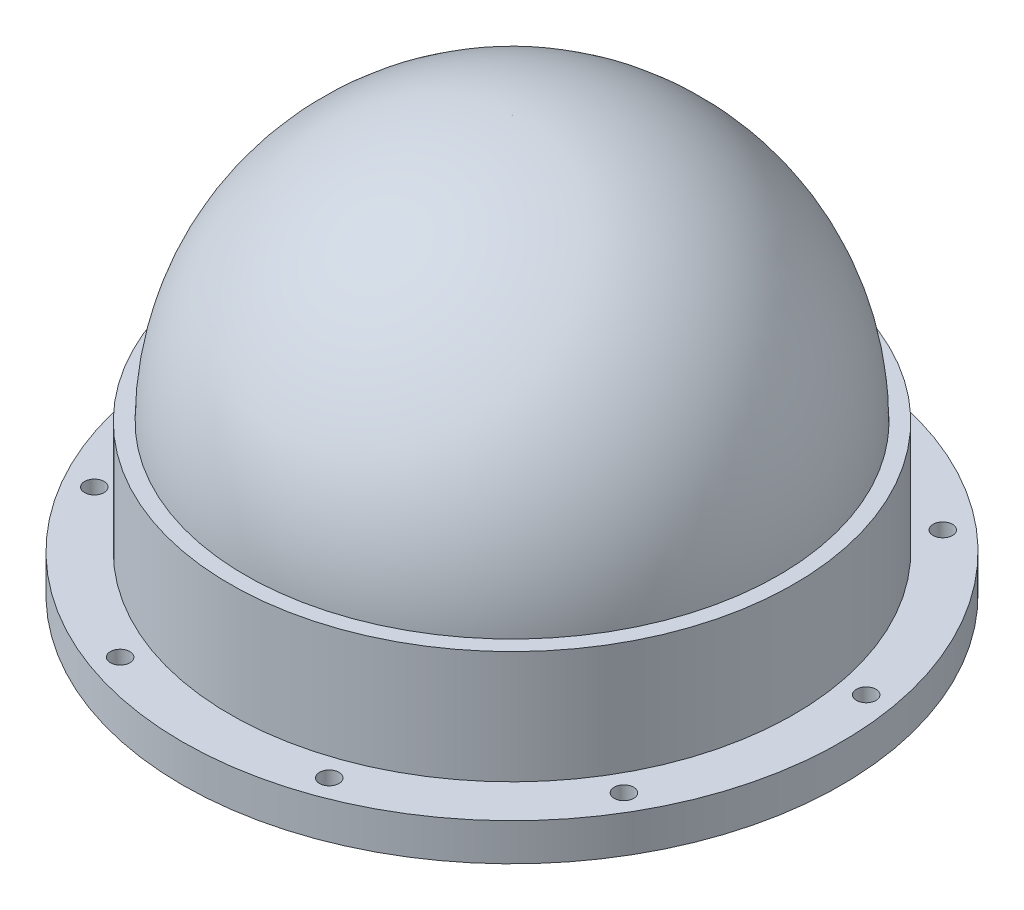
ISO-10303-21;
HEADER;
FILE_DESCRIPTION(('STEP AP214'),'2;1');
FILE_NAME('part.step','',(''),(''),'','','');
FILE_SCHEMA(('AUTOMOTIVE_DESIGN { 1 0 10303 214 1 1 1 1 }'));
ENDSEC;
DATA;
#1=APPLICATION_CONTEXT('core data for automotive mechanical design processes');
#2=APPLICATION_PROTOCOL_DEFINITION('international standard','automotive_design',2000,#1);
#3=PRODUCT_CONTEXT('',#1,'mechanical');
#4=PRODUCT('Part','Part','',(#3));
#5=PRODUCT_RELATED_PRODUCT_CATEGORY('part','',(#4));
#6=PRODUCT_DEFINITION_FORMATION('','',#4);
#7=PRODUCT_DEFINITION_CONTEXT('part definition',#1,'design');
#8=PRODUCT_DEFINITION('design','',#6,#7);
#9=PRODUCT_DEFINITION_SHAPE('','',#8);
#10=(LENGTH_UNIT() NAMED_UNIT(*) SI_UNIT(.MILLI.,.METRE.));
#11=(NAMED_UNIT(*) PLANE_ANGLE_UNIT() SI_UNIT($,.RADIAN.));
#12=(NAMED_UNIT(*) SI_UNIT($,.STERADIAN.) SOLID_ANGLE_UNIT());
#13=UNCERTAINTY_MEASURE_WITH_UNIT(LENGTH_MEASURE(1.E-05),#10,'distance_accuracy_value','');
#14=(GEOMETRIC_REPRESENTATION_CONTEXT(3) GLOBAL_UNCERTAINTY_ASSIGNED_CONTEXT((#13)) GLOBAL_UNIT_ASSIGNED_CONTEXT((#10,
#11,#12)) REPRESENTATION_CONTEXT('',''));
#15=CARTESIAN_POINT('',(0.,0.,0.));
#16=DIRECTION('',(0.,0.,1.));
#17=DIRECTION('',(1.,0.,0.));
#18=AXIS2_PLACEMENT_3D('',#15,#16,#17);
#19=CARTESIAN_POINT('',(0.,51.562,0.));
#20=DIRECTION('',(0.,1.,0.));
#21=DIRECTION('',(1.,0.,0.));
#22=AXIS2_PLACEMENT_3D('',#19,#20,#21);
#23=SPHERICAL_SURFACE('',#22,92.456);
#24=CARTESIAN_POINT('',(0.1,51.562,0.));
#25=DIRECTION('',(1.,0.,0.));
#26=DIRECTION('',(0.,0.,-1.));
#27=AXIS2_PLACEMENT_3D('',#24,#25,#26);
#28=CIRCLE('',#27,92.4559459202057);
#29=CARTESIAN_POINT('',(0.1,144.01789184038,-0.1));
#30=VERTEX_POINT('',#29);
#31=CARTESIAN_POINT('',(0.1,144.017945920206,-7.97691202139997E-13));
#32=VERTEX_POINT('',#31);
#33=EDGE_CURVE('E119',#30,#32,#28,.T.);
#34=ORIENTED_EDGE('',*,*,#33,.T.);
#35=CARTESIAN_POINT('',(0.1,144.01789184038,0.0999999999999999));
#36=VERTEX_POINT('',#35);
#37=EDGE_CURVE('E12',#32,#36,#28,.T.);
#38=ORIENTED_EDGE('',*,*,#37,.T.);
#39=CARTESIAN_POINT('',(0.,51.562,0.0999999999999986));
#40=DIRECTION('',(0.,0.,1.));
#41=DIRECTION('',(0.,-1.,0.));
#42=AXIS2_PLACEMENT_3D('',#39,#40,#41);
#43=CIRCLE('',#42,92.4559459202057);
#44=CARTESIAN_POINT('',(0.,144.017945920206,0.0999999999999999));
#45=VERTEX_POINT('',#44);
#46=EDGE_CURVE('E60',#36,#45,#43,.T.);
#47=ORIENTED_EDGE('',*,*,#46,.T.);
#48=CARTESIAN_POINT('',(0.,144.017945920206,0.));
#49=DIRECTION('',(0.,-1.,0.));
#50=DIRECTION('',(0.,0.,-1.));
#51=AXIS2_PLACEMENT_3D('',#48,#49,#50);
#52=CIRCLE('',#51,0.0999999999476613);
#53=EDGE_CURVE('E211',#32,#45,#52,.T.);
#54=ORIENTED_EDGE('',*,*,#53,.F.);
#55=CARTESIAN_POINT('',(0.100000000000009,144.017945920206,0.));
#56=CARTESIAN_POINT('',(0.0958333349581409,144.017950426855,0.));
#57=CARTESIAN_POINT('',(0.0916666696116241,144.017954651838,0.));
#58=CARTESIAN_POINT('',(0.0833333383854562,144.017962538475,0.));
#59=CARTESIAN_POINT('',(0.0791666725058049,144.017966200127,0.));
#60=CARTESIAN_POINT('',(0.07083334028953,144.017972960101,0.));
#61=CARTESIAN_POINT('',(0.0666666739529063,144.017976058423,0.));
#62=CARTESIAN_POINT('',(0.0583333408988416,144.017981691735,0.));
#63=CARTESIAN_POINT('',(0.0541666741814006,144.017984226726,0.));
#64=CARTESIAN_POINT('',(0.0458333404418841,144.017988733375,0.));
#65=CARTESIAN_POINT('',(0.0416666734198084,144.017990705035,0.));
#66=CARTESIAN_POINT('',(0.0333333391471573,144.017994085022,0.));
#67=CARTESIAN_POINT('',(0.0291666718965817,144.01799549335,0.));
#68=CARTESIAN_POINT('',(0.0208333372431133,144.017997746675,0.));
#69=CARTESIAN_POINT('',(0.0166666698402204,144.017998591672,0.));
#70=CARTESIAN_POINT('',(0.00833333495827252,144.017999718334,0.));
#71=CARTESIAN_POINT('',(0.00416666747921755,144.018,0.));
#72=CARTESIAN_POINT('',(1.62573284894787E-13,144.018,0.));
#73=B_SPLINE_CURVE_WITH_KNOTS('',3,(#55,#56,#57,#58,#59,#60,#61,#62,#63,#64,#65,#66,#67,#68,#69,
#70,#71,#72),.UNSPECIFIED.,.F.,.F.,(4,2,2,2,2,2,2,2,4),(0.,0.0125000024276447,
0.0250000048552893,0.037500007282934,0.0500000097105992,0.0625000121382233,0.0750000145658885,
0.0875000169935332,0.100000019421178),.UNSPECIFIED.);
#74=CARTESIAN_POINT('',(0.,144.018,0.));
#75=VERTEX_POINT('',#74);
#76=EDGE_CURVE('E111',#32,#75,#73,.T.);
#77=ORIENTED_EDGE('',*,*,#76,.T.);
#78=CARTESIAN_POINT('',(0.,51.562,0.));
#79=DIRECTION('',(1.,0.,0.));
#80=DIRECTION('',(0.,0.,-1.));
#81=AXIS2_PLACEMENT_3D('',#78,#79,#80);
#82=CIRCLE('',#81,92.456);
#83=CARTESIAN_POINT('',(0.,144.017945920206,-0.1));
#84=VERTEX_POINT('',#83);
#85=EDGE_CURVE('E193',#84,#75,#82,.T.);
#86=ORIENTED_EDGE('',*,*,#85,.F.);
#87=CARTESIAN_POINT('',(0.,51.562,-0.100000000000015));
#88=DIRECTION('',(0.,0.,-1.));
#89=DIRECTION('',(0.,1.,0.));
#90=AXIS2_PLACEMENT_3D('',#87,#88,#89);
#91=CIRCLE('',#90,92.4559459202057);
#92=EDGE_CURVE('E199',#84,#30,#91,.T.);
#93=ORIENTED_EDGE('',*,*,#92,.T.);
#94=EDGE_LOOP('',(#34,#38,#47,#54,#77,#86,#93));
#95=FACE_BOUND('',#94,.T.);
#96=CARTESIAN_POINT('',(-1.54672976553365E-13,51.5620000000002,0.));
#97=DIRECTION('',(0.,1.,0.));
#98=DIRECTION('',(-1.,0.,0.));
#99=AXIS2_PLACEMENT_3D('',#96,#97,#98);
#100=CIRCLE('',#99,92.4560000000001);
#101=CARTESIAN_POINT('',(-92.4560000000003,51.5620000000003,0.));
#102=VERTEX_POINT('',#101);
#103=EDGE_CURVE('E110',#102,#102,#100,.T.);
#104=ORIENTED_EDGE('',*,*,#103,.T.);
#105=EDGE_LOOP('',(#104));
#106=FACE_BOUND('',#105,.T.);
#107=ADVANCED_FACE('F49',(#95,#106),#23,.T.);
#108=CARTESIAN_POINT('',(0.,56.388,0.));
#109=DIRECTION('',(0.,1.,0.));
#110=DIRECTION('',(-1.,0.,0.));
#111=AXIS2_PLACEMENT_3D('',#108,#109,#110);
#112=SPHERICAL_SURFACE('',#111,80.01);
#113=CARTESIAN_POINT('',(-1.46152911392784E-13,56.3880000000001,0.));
#114=DIRECTION('',(0.,1.,0.));
#115=DIRECTION('',(-1.,0.,0.));
#116=AXIS2_PLACEMENT_3D('',#113,#114,#115);
#117=CIRCLE('',#116,80.0100000000001);
#118=CARTESIAN_POINT('',(-80.0100000000003,56.3880000000003,0.));
#119=VERTEX_POINT('',#118);
#120=EDGE_CURVE('E190',#119,#119,#117,.T.);
#121=ORIENTED_EDGE('',*,*,#120,.F.);
#122=EDGE_LOOP('',(#121));
#123=FACE_BOUND('',#122,.T.);
#124=ADVANCED_FACE('F179',(#123),#112,.F.);
#125=CARTESIAN_POINT('',(0.,144.018,0.));
#126=DIRECTION('',(0.,1.,0.));
#127=DIRECTION('',(-1.,0.,0.));
#128=AXIS2_PLACEMENT_3D('',#125,#126,#127);
#129=CYLINDRICAL_SURFACE('',#128,80.0100000000002);
#130=CARTESIAN_POINT('',(-1.80681596517245E-13,36.8300000000001,0.));
#131=DIRECTION('',(0.,1.,0.));
#132=DIRECTION('',(-1.,0.,0.));
#133=AXIS2_PLACEMENT_3D('',#130,#131,#132);
#134=CIRCLE('',#133,80.0100000000002);
#135=CARTESIAN_POINT('',(-80.0100000000004,36.8300000000003,0.));
#136=VERTEX_POINT('',#135);
#137=EDGE_CURVE('E194',#136,#136,#134,.T.);
#138=ORIENTED_EDGE('',*,*,#137,.F.);
#139=EDGE_LOOP('',(#138));
#140=FACE_BOUND('',#139,.T.);
#141=ORIENTED_EDGE('',*,*,#120,.T.);
#142=EDGE_LOOP('',(#141));
#143=FACE_BOUND('',#142,.T.);
#144=ADVANCED_FACE('F176',(#140,#143),#129,.F.);
#145=CARTESIAN_POINT('',(92.456,36.83,0.));
#146=DIRECTION('',(0.,1.,0.));
#147=DIRECTION('',(-1.,0.,0.));
#148=AXIS2_PLACEMENT_3D('',#145,#146,#147);
#149=PLANE('',#148);
#150=CARTESIAN_POINT('',(-1.80681596517245E-13,36.8300000000002,0.));
#151=DIRECTION('',(0.,1.,0.));
#152=DIRECTION('',(-1.,0.,0.));
#153=AXIS2_PLACEMENT_3D('',#150,#151,#152);
#154=CIRCLE('',#153,92.4560000000002);
#155=CARTESIAN_POINT('',(-92.4560000000004,36.8300000000003,0.));
#156=VERTEX_POINT('',#155);
#157=EDGE_CURVE('E202',#156,#156,#154,.T.);
#158=ORIENTED_EDGE('',*,*,#157,.F.);
#159=EDGE_LOOP('',(#158));
#160=FACE_BOUND('',#159,.T.);
#161=ORIENTED_EDGE('',*,*,#137,.T.);
#162=EDGE_LOOP('',(#161));
#163=FACE_BOUND('',#162,.T.);
#164=ADVANCED_FACE('F172',(#160,#163),#149,.F.);
#165=CARTESIAN_POINT('',(0.,144.018,0.));
#166=DIRECTION('',(0.,1.,0.));
#167=DIRECTION('',(-1.,0.,0.));
#168=AXIS2_PLACEMENT_3D('',#165,#166,#167);
#169=CYLINDRICAL_SURFACE('',#168,92.4560000000002);
#170=ORIENTED_EDGE('',*,*,#103,.F.);
#171=EDGE_LOOP('',(#170));
#172=FACE_BOUND('',#171,.T.);
#173=ORIENTED_EDGE('',*,*,#157,.T.);
#174=EDGE_LOOP('',(#173));
#175=FACE_BOUND('',#174,.T.);
#176=ADVANCED_FACE('F169',(#172,#175),#169,.T.);
#177=CARTESIAN_POINT('',(0.1,0.,0.));
#178=DIRECTION('',(1.,0.,0.));
#179=DIRECTION('',(0.,0.,-1.));
#180=AXIS2_PLACEMENT_3D('',#177,#178,#179);
#181=PLANE('',#180);
#182=ORIENTED_EDGE('',*,*,#33,.F.);
#183=DIRECTION('',(0.,-1.,0.));
#184=VECTOR('',#183,1.);
#185=CARTESIAN_POINT('',(0.1,0.,-0.100000000000023));
#186=LINE('',#185,#184);
#187=CARTESIAN_POINT('',(0.1,144.018,-0.1));
#188=VERTEX_POINT('',#187);
#189=EDGE_CURVE('E102',#188,#30,#186,.T.);
#190=ORIENTED_EDGE('',*,*,#189,.F.);
#191=DIRECTION('',(0.,0.,-1.));
#192=VECTOR('',#191,1.);
#193=CARTESIAN_POINT('',(0.1,144.018,0.));
#194=LINE('',#193,#192);
#195=EDGE_CURVE('E117',#32,#188,#194,.T.);
#196=ORIENTED_EDGE('',*,*,#195,.F.);
#197=EDGE_LOOP('',(#182,#190,#196));
#198=FACE_BOUND('',#197,.T.);
#199=ADVANCED_FACE('F116',(#198),#181,.T.);
#200=CARTESIAN_POINT('',(0.,0.,0.));
#201=DIRECTION('',(1.,0.,0.));
#202=DIRECTION('',(0.,0.,-1.));
#203=AXIS2_PLACEMENT_3D('',#200,#201,#202);
#204=PLANE('',#203);
#205=DIRECTION('',(0.,-1.,0.));
#206=VECTOR('',#205,1.);
#207=CARTESIAN_POINT('',(0.,0.,-0.100000000000023));
#208=LINE('',#207,#206);
#209=CARTESIAN_POINT('',(0.,144.018,-0.1));
#210=VERTEX_POINT('',#209);
#211=EDGE_CURVE('E104',#210,#84,#208,.T.);
#212=ORIENTED_EDGE('',*,*,#211,.T.);
#213=ORIENTED_EDGE('',*,*,#85,.T.);
#214=DIRECTION('',(0.,0.,-1.));
#215=VECTOR('',#214,1.);
#216=CARTESIAN_POINT('',(0.,144.018,0.));
#217=LINE('',#216,#215);
#218=EDGE_CURVE('E138',#75,#210,#217,.T.);
#219=ORIENTED_EDGE('',*,*,#218,.T.);
#220=EDGE_LOOP('',(#212,#213,#219));
#221=FACE_BOUND('',#220,.T.);
#222=ADVANCED_FACE('F165',(#221),#204,.F.);
#223=CARTESIAN_POINT('',(0.1,0.,-0.100000000000023));
#224=DIRECTION('',(0.,0.,-1.));
#225=DIRECTION('',(0.,1.,0.));
#226=AXIS2_PLACEMENT_3D('',#223,#224,#225);
#227=PLANE('',#226);
#228=ORIENTED_EDGE('',*,*,#92,.F.);
#229=ORIENTED_EDGE('',*,*,#211,.F.);
#230=DIRECTION('',(-1.,0.,0.));
#231=VECTOR('',#230,1.);
#232=CARTESIAN_POINT('',(0.1,144.018,-0.1));
#233=LINE('',#232,#231);
#234=EDGE_CURVE('E98',#188,#210,#233,.T.);
#235=ORIENTED_EDGE('',*,*,#234,.F.);
#236=ORIENTED_EDGE('',*,*,#189,.T.);
#237=EDGE_LOOP('',(#228,#229,#235,#236));
#238=FACE_BOUND('',#237,.T.);
#239=ADVANCED_FACE('F101',(#238),#227,.T.);
#240=CARTESIAN_POINT('',(0.1,144.018,0.));
#241=DIRECTION('',(0.,1.,0.));
#242=DIRECTION('',(0.,0.,1.));
#243=AXIS2_PLACEMENT_3D('',#240,#241,#242);
#244=PLANE('',#243);
#245=ORIENTED_EDGE('',*,*,#218,.F.);
#246=ORIENTED_EDGE('',*,*,#76,.F.);
#247=ORIENTED_EDGE('',*,*,#195,.T.);
#248=ORIENTED_EDGE('',*,*,#234,.T.);
#249=EDGE_LOOP('',(#245,#246,#247,#248));
#250=FACE_BOUND('',#249,.T.);
#251=ADVANCED_FACE('F123',(#250),#244,.T.);
#252=CARTESIAN_POINT('',(0.1,0.,0.0999999999999979));
#253=DIRECTION('',(0.,0.,1.));
#254=DIRECTION('',(0.,-1.,0.));
#255=AXIS2_PLACEMENT_3D('',#252,#253,#254);
#256=PLANE('',#255);
#257=ORIENTED_EDGE('',*,*,#46,.F.);
#258=DIRECTION('',(0.,1.,0.));
#259=VECTOR('',#258,1.);
#260=CARTESIAN_POINT('',(0.1,0.,0.0999999999999979));
#261=LINE('',#260,#259);
#262=CARTESIAN_POINT('',(0.1,144.017945920206,0.0999999999999999));
#263=VERTEX_POINT('',#262);
#264=EDGE_CURVE('E74',#36,#263,#261,.T.);
#265=ORIENTED_EDGE('',*,*,#264,.T.);
#266=DIRECTION('',(-1.,0.,0.));
#267=VECTOR('',#266,1.);
#268=CARTESIAN_POINT('',(0.1,144.017945920206,0.0999999999999999));
#269=LINE('',#268,#267);
#270=EDGE_CURVE('E128',#263,#45,#269,.T.);
#271=ORIENTED_EDGE('',*,*,#270,.T.);
#272=EDGE_LOOP('',(#257,#265,#271));
#273=FACE_BOUND('',#272,.T.);
#274=ADVANCED_FACE('F160',(#273),#256,.T.);
#275=CARTESIAN_POINT('',(0.1,144.017945920206,0.));
#276=DIRECTION('',(0.,-1.,0.));
#277=DIRECTION('',(0.,0.,-1.));
#278=AXIS2_PLACEMENT_3D('',#275,#276,#277);
#279=PLANE('',#278);
#280=DIRECTION('',(0.,0.,1.));
#281=VECTOR('',#280,1.);
#282=CARTESIAN_POINT('',(0.1,144.017945920206,0.));
#283=LINE('',#282,#281);
#284=EDGE_CURVE('E68',#32,#263,#283,.T.);
#285=ORIENTED_EDGE('',*,*,#284,.F.);
#286=ORIENTED_EDGE('',*,*,#53,.T.);
#287=ORIENTED_EDGE('',*,*,#270,.F.);
#288=EDGE_LOOP('',(#285,#286,#287));
#289=FACE_BOUND('',#288,.T.);
#290=ADVANCED_FACE('F161',(#289),#279,.F.);
#291=ORIENTED_EDGE('',*,*,#37,.F.);
#292=ORIENTED_EDGE('',*,*,#284,.T.);
#293=ORIENTED_EDGE('',*,*,#264,.F.);
#294=EDGE_LOOP('',(#291,#292,#293));
#295=FACE_BOUND('',#294,.T.);
#296=ADVANCED_FACE('F226',(#295),#181,.T.);
#297=CLOSED_SHELL('',(#107,#124,#144,#164,#176,#199,#222,#239,#251,#274,#290,#296));
#298=MANIFOLD_SOLID_BREP('B2',#297);
#299=CARTESIAN_POINT('',(79.248,0.,0.));
#300=DIRECTION('',(0.,-1.,0.));
#301=DIRECTION('',(0.,0.,-1.));
#302=AXIS2_PLACEMENT_3D('',#299,#300,#301);
#303=PLANE('',#302);
#304=CARTESIAN_POINT('',(-5.99954073654749E-12,0.,-106.045));
#305=DIRECTION('',(0.,-1.,0.));
#306=DIRECTION('',(0.,0.,-1.));
#307=AXIS2_PLACEMENT_3D('',#304,#305,#306);
#308=CIRCLE('',#307,3.3782);
#309=CARTESIAN_POINT('',(-5.99954073654749E-12,0.,-109.4232));
#310=VERTEX_POINT('',#309);
#311=EDGE_CURVE('E404',#310,#310,#308,.T.);
#312=ORIENTED_EDGE('',*,*,#311,.F.);
#313=EDGE_LOOP('',(#312));
#314=FACE_BOUND('',#313,.T.);
#315=CARTESIAN_POINT('',(68.1644120692045,0.,-81.2351829705559));
#316=DIRECTION('',(0.,-1.,0.));
#317=DIRECTION('',(0.,0.,-1.));
#318=AXIS2_PLACEMENT_3D('',#315,#316,#317);
#319=CIRCLE('',#318,3.3782);
#320=CARTESIAN_POINT('',(68.1644120692045,0.,-84.6133829705559));
#321=VERTEX_POINT('',#320);
#322=EDGE_CURVE('E398',#321,#321,#319,.T.);
#323=ORIENTED_EDGE('',*,*,#322,.F.);
#324=EDGE_LOOP('',(#323));
#325=FACE_BOUND('',#324,.T.);
#326=CARTESIAN_POINT('',(104.433938168179,0.,-18.4145210006955));
#327=DIRECTION('',(0.,-1.,0.));
#328=DIRECTION('',(0.,0.,-1.));
#329=AXIS2_PLACEMENT_3D('',#326,#327,#328);
#330=CIRCLE('',#329,3.3782);
#331=CARTESIAN_POINT('',(104.433938168179,0.,-21.7927210006955));
#332=VERTEX_POINT('',#331);
#333=EDGE_CURVE('E392',#332,#332,#330,.T.);
#334=ORIENTED_EDGE('',*,*,#333,.F.);
#335=EDGE_LOOP('',(#334));
#336=FACE_BOUND('',#335,.T.);
#337=CARTESIAN_POINT('',(91.8376639443238,0.,53.0224999999948));
#338=DIRECTION('',(0.,-1.,0.));
#339=DIRECTION('',(0.,0.,-1.));
#340=AXIS2_PLACEMENT_3D('',#337,#338,#339);
#341=CIRCLE('',#340,3.3782);
#342=CARTESIAN_POINT('',(91.8376639443238,0.,49.6442999999948));
#343=VERTEX_POINT('',#342);
#344=EDGE_CURVE('E386',#343,#343,#341,.T.);
#345=ORIENTED_EDGE('',*,*,#344,.F.);
#346=EDGE_LOOP('',(#345));
#347=FACE_BOUND('',#346,.T.);
#348=CARTESIAN_POINT('',(36.2695260989762,0.,99.6497039712396));
#349=DIRECTION('',(0.,-1.,0.));
#350=DIRECTION('',(0.,0.,-1.));
#351=AXIS2_PLACEMENT_3D('',#348,#349,#350);
#352=CIRCLE('',#351,3.3782);
#353=CARTESIAN_POINT('',(36.2695260989762,0.,96.2715039712396));
#354=VERTEX_POINT('',#353);
#355=EDGE_CURVE('E380',#354,#354,#352,.T.);
#356=ORIENTED_EDGE('',*,*,#355,.F.);
#357=EDGE_LOOP('',(#356));
#358=FACE_BOUND('',#357,.T.);
#359=CARTESIAN_POINT('',(-36.2695260989649,0.,99.6497039712437));
#360=DIRECTION('',(0.,-1.,0.));
#361=DIRECTION('',(0.,0.,-1.));
#362=AXIS2_PLACEMENT_3D('',#359,#360,#361);
#363=CIRCLE('',#362,3.3782);
#364=CARTESIAN_POINT('',(-36.2695260989649,0.,96.2715039712437));
#365=VERTEX_POINT('',#364);
#366=EDGE_CURVE('E374',#365,#365,#363,.T.);
#367=ORIENTED_EDGE('',*,*,#366,.F.);
#368=EDGE_LOOP('',(#367));
#369=FACE_BOUND('',#368,.T.);
#370=CARTESIAN_POINT('',(-91.8376639443178,0.,53.0225000000052));
#371=DIRECTION('',(0.,-1.,0.));
#372=DIRECTION('',(0.,0.,-1.));
#373=AXIS2_PLACEMENT_3D('',#370,#371,#372);
#374=CIRCLE('',#373,3.3782);
#375=CARTESIAN_POINT('',(-91.8376639443178,0.,49.6443000000052));
#376=VERTEX_POINT('',#375);
#377=EDGE_CURVE('E368',#376,#376,#374,.T.);
#378=ORIENTED_EDGE('',*,*,#377,.F.);
#379=EDGE_LOOP('',(#378));
#380=FACE_BOUND('',#379,.T.);
#381=CARTESIAN_POINT('',(-104.433938168181,0.,-18.4145210006837));
#382=DIRECTION('',(0.,-1.,0.));
#383=DIRECTION('',(0.,0.,-1.));
#384=AXIS2_PLACEMENT_3D('',#381,#382,#383);
#385=CIRCLE('',#384,3.3782);
#386=CARTESIAN_POINT('',(-104.433938168181,0.,-21.7927210006837));
#387=VERTEX_POINT('',#386);
#388=EDGE_CURVE('E362',#387,#387,#385,.T.);
#389=ORIENTED_EDGE('',*,*,#388,.F.);
#390=EDGE_LOOP('',(#389));
#391=FACE_BOUND('',#390,.T.);
#392=CARTESIAN_POINT('',(-68.1644120692137,0.,-81.2351829705482));
#393=DIRECTION('',(0.,-1.,0.));
#394=DIRECTION('',(0.,0.,-1.));
#395=AXIS2_PLACEMENT_3D('',#392,#393,#394);
#396=CIRCLE('',#395,3.3782);
#397=CARTESIAN_POINT('',(-68.1644120692137,0.,-84.6133829705482));
#398=VERTEX_POINT('',#397);
#399=EDGE_CURVE('E356',#398,#398,#396,.T.);
#400=ORIENTED_EDGE('',*,*,#399,.F.);
#401=EDGE_LOOP('',(#400));
#402=FACE_BOUND('',#401,.T.);
#403=CARTESIAN_POINT('',(0.,0.,0.));
#404=DIRECTION('',(0.,-1.,0.));
#405=DIRECTION('',(0.,0.,-1.));
#406=AXIS2_PLACEMENT_3D('',#403,#404,#405);
#407=CIRCLE('',#406,114.3);
#408=CARTESIAN_POINT('',(0.,0.,-114.3));
#409=VERTEX_POINT('',#408);
#410=EDGE_CURVE('E48',#409,#409,#407,.T.);
#411=ORIENTED_EDGE('',*,*,#410,.T.);
#412=EDGE_LOOP('',(#411));
#413=FACE_BOUND('',#412,.T.);
#414=CARTESIAN_POINT('',(0.,0.,0.));
#415=DIRECTION('',(0.,-1.,0.));
#416=DIRECTION('',(0.,0.,-1.));
#417=AXIS2_PLACEMENT_3D('',#414,#415,#416);
#418=CIRCLE('',#417,79.248);
#419=CARTESIAN_POINT('',(0.,0.,-79.248));
#420=VERTEX_POINT('',#419);
#421=EDGE_CURVE('E353',#420,#420,#418,.T.);
#422=ORIENTED_EDGE('',*,*,#421,.F.);
#423=EDGE_LOOP('',(#422));
#424=FACE_BOUND('',#423,.T.);
#425=ADVANCED_FACE('F325',(#314,#325,#336,#347,#358,#369,#380,#391,#402,#413,#424),#303,.T.);
#426=CARTESIAN_POINT('',(0.,0.,0.));
#427=DIRECTION('',(0.,-1.,0.));
#428=DIRECTION('',(0.,0.,-1.));
#429=AXIS2_PLACEMENT_3D('',#426,#427,#428);
#430=CYLINDRICAL_SURFACE('',#429,114.3);
#431=CARTESIAN_POINT('',(0.,12.954,0.));
#432=DIRECTION('',(0.,-1.,0.));
#433=DIRECTION('',(0.,0.,-1.));
#434=AXIS2_PLACEMENT_3D('',#431,#432,#433);
#435=CIRCLE('',#434,114.3);
#436=CARTESIAN_POINT('',(0.,12.954,-114.3));
#437=VERTEX_POINT('',#436);
#438=EDGE_CURVE('E331',#437,#437,#435,.T.);
#439=ORIENTED_EDGE('',*,*,#438,.T.);
#440=EDGE_LOOP('',(#439));
#441=FACE_BOUND('',#440,.T.);
#442=ORIENTED_EDGE('',*,*,#410,.F.);
#443=EDGE_LOOP('',(#442));
#444=FACE_BOUND('',#443,.T.);
#445=ADVANCED_FACE('F418',(#441,#444),#430,.T.);
#446=CARTESIAN_POINT('',(114.3,12.954,0.));
#447=DIRECTION('',(0.,1.,0.));
#448=DIRECTION('',(0.,0.,1.));
#449=AXIS2_PLACEMENT_3D('',#446,#447,#448);
#450=PLANE('',#449);
#451=CARTESIAN_POINT('',(-5.99954073654749E-12,12.954,-106.045));
#452=DIRECTION('',(0.,1.,0.));
#453=DIRECTION('',(0.,0.,1.));
#454=AXIS2_PLACEMENT_3D('',#451,#452,#453);
#455=CIRCLE('',#454,3.3782);
#456=CARTESIAN_POINT('',(-5.99954073654749E-12,12.954,-102.6668));
#457=VERTEX_POINT('',#456);
#458=EDGE_CURVE('E407',#457,#457,#455,.T.);
#459=ORIENTED_EDGE('',*,*,#458,.F.);
#460=EDGE_LOOP('',(#459));
#461=FACE_BOUND('',#460,.T.);
#462=CARTESIAN_POINT('',(68.1644120692045,12.954,-81.2351829705559));
#463=DIRECTION('',(0.,1.,0.));
#464=DIRECTION('',(0.,0.,1.));
#465=AXIS2_PLACEMENT_3D('',#462,#463,#464);
#466=CIRCLE('',#465,3.3782);
#467=CARTESIAN_POINT('',(68.1644120692045,12.954,-77.8569829705559));
#468=VERTEX_POINT('',#467);
#469=EDGE_CURVE('E401',#468,#468,#466,.T.);
#470=ORIENTED_EDGE('',*,*,#469,.F.);
#471=EDGE_LOOP('',(#470));
#472=FACE_BOUND('',#471,.T.);
#473=CARTESIAN_POINT('',(104.433938168179,12.954,-18.4145210006955));
#474=DIRECTION('',(0.,1.,0.));
#475=DIRECTION('',(0.,0.,1.));
#476=AXIS2_PLACEMENT_3D('',#473,#474,#475);
#477=CIRCLE('',#476,3.3782);
#478=CARTESIAN_POINT('',(104.433938168179,12.954,-15.0363210006955));
#479=VERTEX_POINT('',#478);
#480=EDGE_CURVE('E395',#479,#479,#477,.T.);
#481=ORIENTED_EDGE('',*,*,#480,.F.);
#482=EDGE_LOOP('',(#481));
#483=FACE_BOUND('',#482,.T.);
#484=CARTESIAN_POINT('',(91.8376639443238,12.954,53.0224999999948));
#485=DIRECTION('',(0.,1.,0.));
#486=DIRECTION('',(0.,0.,1.));
#487=AXIS2_PLACEMENT_3D('',#484,#485,#486);
#488=CIRCLE('',#487,3.3782);
#489=CARTESIAN_POINT('',(91.8376639443238,12.954,56.4006999999948));
#490=VERTEX_POINT('',#489);
#491=EDGE_CURVE('E389',#490,#490,#488,.T.);
#492=ORIENTED_EDGE('',*,*,#491,.F.);
#493=EDGE_LOOP('',(#492));
#494=FACE_BOUND('',#493,.T.);
#495=CARTESIAN_POINT('',(36.2695260989762,12.954,99.6497039712396));
#496=DIRECTION('',(0.,1.,0.));
#497=DIRECTION('',(0.,0.,1.));
#498=AXIS2_PLACEMENT_3D('',#495,#496,#497);
#499=CIRCLE('',#498,3.3782);
#500=CARTESIAN_POINT('',(36.2695260989762,12.954,103.02790397124));
#501=VERTEX_POINT('',#500);
#502=EDGE_CURVE('E383',#501,#501,#499,.T.);
#503=ORIENTED_EDGE('',*,*,#502,.F.);
#504=EDGE_LOOP('',(#503));
#505=FACE_BOUND('',#504,.T.);
#506=CARTESIAN_POINT('',(-36.2695260989649,12.954,99.6497039712437));
#507=DIRECTION('',(0.,1.,0.));
#508=DIRECTION('',(0.,0.,1.));
#509=AXIS2_PLACEMENT_3D('',#506,#507,#508);
#510=CIRCLE('',#509,3.3782);
#511=CARTESIAN_POINT('',(-36.2695260989649,12.954,103.027903971244));
#512=VERTEX_POINT('',#511);
#513=EDGE_CURVE('E377',#512,#512,#510,.T.);
#514=ORIENTED_EDGE('',*,*,#513,.F.);
#515=EDGE_LOOP('',(#514));
#516=FACE_BOUND('',#515,.T.);
#517=CARTESIAN_POINT('',(-91.8376639443178,12.954,53.0225000000052));
#518=DIRECTION('',(0.,1.,0.));
#519=DIRECTION('',(0.,0.,1.));
#520=AXIS2_PLACEMENT_3D('',#517,#518,#519);
#521=CIRCLE('',#520,3.3782);
#522=CARTESIAN_POINT('',(-91.8376639443178,12.954,56.4007000000052));
#523=VERTEX_POINT('',#522);
#524=EDGE_CURVE('E371',#523,#523,#521,.T.);
#525=ORIENTED_EDGE('',*,*,#524,.F.);
#526=EDGE_LOOP('',(#525));
#527=FACE_BOUND('',#526,.T.);
#528=CARTESIAN_POINT('',(-104.433938168181,12.954,-18.4145210006837));
#529=DIRECTION('',(0.,1.,0.));
#530=DIRECTION('',(0.,0.,1.));
#531=AXIS2_PLACEMENT_3D('',#528,#529,#530);
#532=CIRCLE('',#531,3.3782);
#533=CARTESIAN_POINT('',(-104.433938168181,12.954,-15.0363210006837));
#534=VERTEX_POINT('',#533);
#535=EDGE_CURVE('E365',#534,#534,#532,.T.);
#536=ORIENTED_EDGE('',*,*,#535,.F.);
#537=EDGE_LOOP('',(#536));
#538=FACE_BOUND('',#537,.T.);
#539=CARTESIAN_POINT('',(-68.1644120692137,12.954,-81.2351829705482));
#540=DIRECTION('',(0.,1.,0.));
#541=DIRECTION('',(0.,0.,1.));
#542=AXIS2_PLACEMENT_3D('',#539,#540,#541);
#543=CIRCLE('',#542,3.3782);
#544=CARTESIAN_POINT('',(-68.1644120692137,12.954,-77.8569829705482));
#545=VERTEX_POINT('',#544);
#546=EDGE_CURVE('E359',#545,#545,#543,.T.);
#547=ORIENTED_EDGE('',*,*,#546,.F.);
#548=EDGE_LOOP('',(#547));
#549=FACE_BOUND('',#548,.T.);
#550=CARTESIAN_POINT('',(0.,12.954,0.));
#551=DIRECTION('',(0.,-1.,0.));
#552=DIRECTION('',(0.,0.,-1.));
#553=AXIS2_PLACEMENT_3D('',#550,#551,#552);
#554=CIRCLE('',#553,97.79);
#555=CARTESIAN_POINT('',(0.,12.954,-97.79));
#556=VERTEX_POINT('',#555);
#557=EDGE_CURVE('E335',#556,#556,#554,.T.);
#558=ORIENTED_EDGE('',*,*,#557,.T.);
#559=EDGE_LOOP('',(#558));
#560=FACE_BOUND('',#559,.T.);
#561=ORIENTED_EDGE('',*,*,#438,.F.);
#562=EDGE_LOOP('',(#561));
#563=FACE_BOUND('',#562,.T.);
#564=ADVANCED_FACE('F414',(#461,#472,#483,#494,#505,#516,#527,#538,#549,#560,#563),#450,.T.);
#565=CARTESIAN_POINT('',(0.,0.,0.));
#566=DIRECTION('',(0.,-1.,0.));
#567=DIRECTION('',(0.,0.,-1.));
#568=AXIS2_PLACEMENT_3D('',#565,#566,#567);
#569=CYLINDRICAL_SURFACE('',#568,97.79);
#570=CARTESIAN_POINT('',(0.,52.07,0.));
#571=DIRECTION('',(0.,-1.,0.));
#572=DIRECTION('',(0.,0.,-1.));
#573=AXIS2_PLACEMENT_3D('',#570,#571,#572);
#574=CIRCLE('',#573,97.79);
#575=CARTESIAN_POINT('',(0.,52.07,-97.79));
#576=VERTEX_POINT('',#575);
#577=EDGE_CURVE('E339',#576,#576,#574,.T.);
#578=ORIENTED_EDGE('',*,*,#577,.T.);
#579=EDGE_LOOP('',(#578));
#580=FACE_BOUND('',#579,.T.);
#581=ORIENTED_EDGE('',*,*,#557,.F.);
#582=EDGE_LOOP('',(#581));
#583=FACE_BOUND('',#582,.T.);
#584=ADVANCED_FACE('F417',(#580,#583),#569,.T.);
#585=CARTESIAN_POINT('',(97.79,52.07,0.));
#586=DIRECTION('',(0.,1.,0.));
#587=DIRECTION('',(0.,0.,1.));
#588=AXIS2_PLACEMENT_3D('',#585,#586,#587);
#589=PLANE('',#588);
#590=CARTESIAN_POINT('',(0.,52.07,0.));
#591=DIRECTION('',(0.,-1.,0.));
#592=DIRECTION('',(0.,0.,-1.));
#593=AXIS2_PLACEMENT_3D('',#590,#591,#592);
#594=CIRCLE('',#593,92.456);
#595=CARTESIAN_POINT('',(0.,52.07,-92.456));
#596=VERTEX_POINT('',#595);
#597=EDGE_CURVE('E344',#596,#596,#594,.T.);
#598=ORIENTED_EDGE('',*,*,#597,.T.);
#599=EDGE_LOOP('',(#598));
#600=FACE_BOUND('',#599,.T.);
#601=ORIENTED_EDGE('',*,*,#577,.F.);
#602=EDGE_LOOP('',(#601));
#603=FACE_BOUND('',#602,.T.);
#604=ADVANCED_FACE('F440',(#600,#603),#589,.T.);
#605=CARTESIAN_POINT('',(0.,0.,0.));
#606=DIRECTION('',(0.,-1.,0.));
#607=DIRECTION('',(0.,0.,-1.));
#608=AXIS2_PLACEMENT_3D('',#605,#606,#607);
#609=CYLINDRICAL_SURFACE('',#608,92.456);
#610=CARTESIAN_POINT('',(0.,36.83,0.));
#611=DIRECTION('',(0.,-1.,0.));
#612=DIRECTION('',(0.,0.,-1.));
#613=AXIS2_PLACEMENT_3D('',#610,#611,#612);
#614=CIRCLE('',#613,92.456);
#615=CARTESIAN_POINT('',(0.,36.83,-92.456));
#616=VERTEX_POINT('',#615);
#617=EDGE_CURVE('E347',#616,#616,#614,.T.);
#618=ORIENTED_EDGE('',*,*,#617,.T.);
#619=EDGE_LOOP('',(#618));
#620=FACE_BOUND('',#619,.T.);
#621=ORIENTED_EDGE('',*,*,#597,.F.);
#622=EDGE_LOOP('',(#621));
#623=FACE_BOUND('',#622,.T.);
#624=ADVANCED_FACE('F446',(#620,#623),#609,.F.);
#625=CARTESIAN_POINT('',(92.456,36.83,0.));
#626=DIRECTION('',(0.,1.,0.));
#627=DIRECTION('',(0.,0.,1.));
#628=AXIS2_PLACEMENT_3D('',#625,#626,#627);
#629=PLANE('',#628);
#630=CARTESIAN_POINT('',(0.,36.83,0.));
#631=DIRECTION('',(0.,-1.,0.));
#632=DIRECTION('',(0.,0.,-1.));
#633=AXIS2_PLACEMENT_3D('',#630,#631,#632);
#634=CIRCLE('',#633,79.248);
#635=CARTESIAN_POINT('',(0.,36.83,-79.248));
#636=VERTEX_POINT('',#635);
#637=EDGE_CURVE('E350',#636,#636,#634,.T.);
#638=ORIENTED_EDGE('',*,*,#637,.T.);
#639=EDGE_LOOP('',(#638));
#640=FACE_BOUND('',#639,.T.);
#641=ORIENTED_EDGE('',*,*,#617,.F.);
#642=EDGE_LOOP('',(#641));
#643=FACE_BOUND('',#642,.T.);
#644=ADVANCED_FACE('F478',(#640,#643),#629,.T.);
#645=CARTESIAN_POINT('',(0.,0.,0.));
#646=DIRECTION('',(0.,-1.,0.));
#647=DIRECTION('',(0.,0.,-1.));
#648=AXIS2_PLACEMENT_3D('',#645,#646,#647);
#649=CYLINDRICAL_SURFACE('',#648,79.248);
#650=ORIENTED_EDGE('',*,*,#421,.T.);
#651=EDGE_LOOP('',(#650));
#652=FACE_BOUND('',#651,.T.);
#653=ORIENTED_EDGE('',*,*,#637,.F.);
#654=EDGE_LOOP('',(#653));
#655=FACE_BOUND('',#654,.T.);
#656=ADVANCED_FACE('F474',(#652,#655),#649,.F.);
#657=CARTESIAN_POINT('',(-68.1644120692137,12.954,-81.2351829705482));
#658=DIRECTION('',(0.,1.,0.));
#659=DIRECTION('',(0.,0.,1.));
#660=AXIS2_PLACEMENT_3D('',#657,#658,#659);
#661=CYLINDRICAL_SURFACE('',#660,3.3782);
#662=ORIENTED_EDGE('',*,*,#546,.T.);
#663=EDGE_LOOP('',(#662));
#664=FACE_BOUND('',#663,.T.);
#665=ORIENTED_EDGE('',*,*,#399,.T.);
#666=EDGE_LOOP('',(#665));
#667=FACE_BOUND('',#666,.T.);
#668=ADVANCED_FACE('F477',(#664,#667),#661,.F.);
#669=CARTESIAN_POINT('',(-104.433938168181,12.954,-18.4145210006837));
#670=DIRECTION('',(0.,1.,0.));
#671=DIRECTION('',(0.,0.,1.));
#672=AXIS2_PLACEMENT_3D('',#669,#670,#671);
#673=CYLINDRICAL_SURFACE('',#672,3.3782);
#674=ORIENTED_EDGE('',*,*,#535,.T.);
#675=EDGE_LOOP('',(#674));
#676=FACE_BOUND('',#675,.T.);
#677=ORIENTED_EDGE('',*,*,#388,.T.);
#678=EDGE_LOOP('',(#677));
#679=FACE_BOUND('',#678,.T.);
#680=ADVANCED_FACE('F498',(#676,#679),#673,.F.);
#681=CARTESIAN_POINT('',(-91.8376639443178,12.954,53.0225000000052));
#682=DIRECTION('',(0.,1.,0.));
#683=DIRECTION('',(0.,0.,1.));
#684=AXIS2_PLACEMENT_3D('',#681,#682,#683);
#685=CYLINDRICAL_SURFACE('',#684,3.3782);
#686=ORIENTED_EDGE('',*,*,#524,.T.);
#687=EDGE_LOOP('',(#686));
#688=FACE_BOUND('',#687,.T.);
#689=ORIENTED_EDGE('',*,*,#377,.T.);
#690=EDGE_LOOP('',(#689));
#691=FACE_BOUND('',#690,.T.);
#692=ADVANCED_FACE('F502',(#688,#691),#685,.F.);
#693=CARTESIAN_POINT('',(-36.2695260989649,12.954,99.6497039712437));
#694=DIRECTION('',(0.,1.,0.));
#695=DIRECTION('',(0.,0.,1.));
#696=AXIS2_PLACEMENT_3D('',#693,#694,#695);
#697=CYLINDRICAL_SURFACE('',#696,3.3782);
#698=ORIENTED_EDGE('',*,*,#513,.T.);
#699=EDGE_LOOP('',(#698));
#700=FACE_BOUND('',#699,.T.);
#701=ORIENTED_EDGE('',*,*,#366,.T.);
#702=EDGE_LOOP('',(#701));
#703=FACE_BOUND('',#702,.T.);
#704=ADVANCED_FACE('F506',(#700,#703),#697,.F.);
#705=CARTESIAN_POINT('',(36.2695260989762,12.954,99.6497039712396));
#706=DIRECTION('',(0.,1.,0.));
#707=DIRECTION('',(0.,0.,1.));
#708=AXIS2_PLACEMENT_3D('',#705,#706,#707);
#709=CYLINDRICAL_SURFACE('',#708,3.3782);
#710=ORIENTED_EDGE('',*,*,#502,.T.);
#711=EDGE_LOOP('',(#710));
#712=FACE_BOUND('',#711,.T.);
#713=ORIENTED_EDGE('',*,*,#355,.T.);
#714=EDGE_LOOP('',(#713));
#715=FACE_BOUND('',#714,.T.);
#716=ADVANCED_FACE('F510',(#712,#715),#709,.F.);
#717=CARTESIAN_POINT('',(91.8376639443238,12.954,53.0224999999948));
#718=DIRECTION('',(0.,1.,0.));
#719=DIRECTION('',(0.,0.,1.));
#720=AXIS2_PLACEMENT_3D('',#717,#718,#719);
#721=CYLINDRICAL_SURFACE('',#720,3.3782);
#722=ORIENTED_EDGE('',*,*,#491,.T.);
#723=EDGE_LOOP('',(#722));
#724=FACE_BOUND('',#723,.T.);
#725=ORIENTED_EDGE('',*,*,#344,.T.);
#726=EDGE_LOOP('',(#725));
#727=FACE_BOUND('',#726,.T.);
#728=ADVANCED_FACE('F514',(#724,#727),#721,.F.);
#729=CARTESIAN_POINT('',(104.433938168179,12.954,-18.4145210006955));
#730=DIRECTION('',(0.,1.,0.));
#731=DIRECTION('',(0.,0.,1.));
#732=AXIS2_PLACEMENT_3D('',#729,#730,#731);
#733=CYLINDRICAL_SURFACE('',#732,3.3782);
#734=ORIENTED_EDGE('',*,*,#480,.T.);
#735=EDGE_LOOP('',(#734));
#736=FACE_BOUND('',#735,.T.);
#737=ORIENTED_EDGE('',*,*,#333,.T.);
#738=EDGE_LOOP('',(#737));
#739=FACE_BOUND('',#738,.T.);
#740=ADVANCED_FACE('F518',(#736,#739),#733,.F.);
#741=CARTESIAN_POINT('',(68.1644120692045,12.954,-81.2351829705559));
#742=DIRECTION('',(0.,1.,0.));
#743=DIRECTION('',(0.,0.,1.));
#744=AXIS2_PLACEMENT_3D('',#741,#742,#743);
#745=CYLINDRICAL_SURFACE('',#744,3.3782);
#746=ORIENTED_EDGE('',*,*,#469,.T.);
#747=EDGE_LOOP('',(#746));
#748=FACE_BOUND('',#747,.T.);
#749=ORIENTED_EDGE('',*,*,#322,.T.);
#750=EDGE_LOOP('',(#749));
#751=FACE_BOUND('',#750,.T.);
#752=ADVANCED_FACE('F522',(#748,#751),#745,.F.);
#753=CARTESIAN_POINT('',(-5.99954073654749E-12,12.954,-106.045));
#754=DIRECTION('',(0.,1.,0.));
#755=DIRECTION('',(0.,0.,1.));
#756=AXIS2_PLACEMENT_3D('',#753,#754,#755);
#757=CYLINDRICAL_SURFACE('',#756,3.3782);
#758=ORIENTED_EDGE('',*,*,#458,.T.);
#759=EDGE_LOOP('',(#758));
#760=FACE_BOUND('',#759,.T.);
#761=ORIENTED_EDGE('',*,*,#311,.T.);
#762=EDGE_LOOP('',(#761));
#763=FACE_BOUND('',#762,.T.);
#764=ADVANCED_FACE('F411',(#760,#763),#757,.F.);
#765=CLOSED_SHELL('',(#425,#445,#564,#584,#604,#624,#644,#656,#668,#680,#692,#704,#716,#728,
#740,#752,#764));
#766=MANIFOLD_SOLID_BREP('B6',#765);
#767=ADVANCED_BREP_SHAPE_REPRESENTATION('',(#18,#298,#766),#14);
#768=SHAPE_DEFINITION_REPRESENTATION(#9,#767);
ENDSEC;
END-ISO-10303-21;
